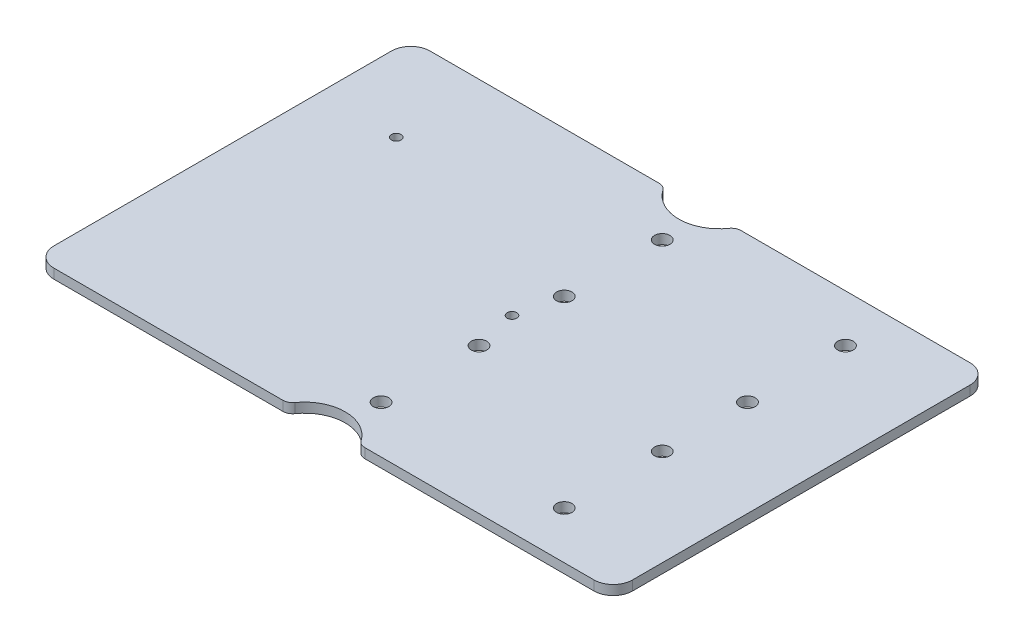
ISO-10303-21;
HEADER;
FILE_DESCRIPTION(('STEP AP214'),'2;1');
FILE_NAME('part.step','',(''),(''),'','','');
FILE_SCHEMA(('AUTOMOTIVE_DESIGN { 1 0 10303 214 1 1 1 1 }'));
ENDSEC;
DATA;
#1=APPLICATION_CONTEXT('core data for automotive mechanical design processes');
#2=APPLICATION_PROTOCOL_DEFINITION('international standard','automotive_design',2000,#1);
#3=PRODUCT_CONTEXT('',#1,'mechanical');
#4=PRODUCT('Part','Part','',(#3));
#5=PRODUCT_RELATED_PRODUCT_CATEGORY('part','',(#4));
#6=PRODUCT_DEFINITION_FORMATION('','',#4);
#7=PRODUCT_DEFINITION_CONTEXT('part definition',#1,'design');
#8=PRODUCT_DEFINITION('design','',#6,#7);
#9=PRODUCT_DEFINITION_SHAPE('','',#8);
#10=(LENGTH_UNIT() NAMED_UNIT(*) SI_UNIT(.MILLI.,.METRE.));
#11=(NAMED_UNIT(*) PLANE_ANGLE_UNIT() SI_UNIT($,.RADIAN.));
#12=(NAMED_UNIT(*) SI_UNIT($,.STERADIAN.) SOLID_ANGLE_UNIT());
#13=UNCERTAINTY_MEASURE_WITH_UNIT(LENGTH_MEASURE(1.E-05),#10,'distance_accuracy_value','');
#14=(GEOMETRIC_REPRESENTATION_CONTEXT(3) GLOBAL_UNCERTAINTY_ASSIGNED_CONTEXT((#13)) GLOBAL_UNIT_ASSIGNED_CONTEXT((#10,
#11,#12)) REPRESENTATION_CONTEXT('',''));
#15=CARTESIAN_POINT('',(0.,0.,0.));
#16=DIRECTION('',(0.,0.,1.));
#17=DIRECTION('',(1.,0.,0.));
#18=AXIS2_PLACEMENT_3D('',#15,#16,#17);
#19=CARTESIAN_POINT('',(20.,1.,19.5));
#20=DIRECTION('',(0.,0.,-1.));
#21=DIRECTION('',(-1.,0.,0.));
#22=AXIS2_PLACEMENT_3D('',#19,#20,#21);
#23=PLANE('',#22);
#24=DIRECTION('',(1.,0.,0.));
#25=VECTOR('',#24,1.);
#26=CARTESIAN_POINT('',(20.,1.,19.5));
#27=LINE('',#26,#25);
#28=CARTESIAN_POINT('',(-5.75264788368094,1.,19.5));
#29=VERTEX_POINT('',#28);
#30=CARTESIAN_POINT('',(18.,1.,19.5));
#31=VERTEX_POINT('',#30);
#32=EDGE_CURVE('E171',#29,#31,#27,.T.);
#33=ORIENTED_EDGE('',*,*,#32,.F.);
#34=DIRECTION('',(0.,1.,0.));
#35=VECTOR('',#34,1.);
#36=CARTESIAN_POINT('',(-5.75264788368094,0.,19.5));
#37=LINE('',#36,#35);
#38=CARTESIAN_POINT('',(-5.75264788368094,0.,19.5));
#39=VERTEX_POINT('',#38);
#40=EDGE_CURVE('E42',#29,#39,#37,.F.);
#41=ORIENTED_EDGE('',*,*,#40,.T.);
#42=DIRECTION('',(1.,0.,0.));
#43=VECTOR('',#42,1.);
#44=CARTESIAN_POINT('',(20.,0.,19.5));
#45=LINE('',#44,#43);
#46=CARTESIAN_POINT('',(18.,0.,19.5));
#47=VERTEX_POINT('',#46);
#48=EDGE_CURVE('E318',#39,#47,#45,.T.);
#49=ORIENTED_EDGE('',*,*,#48,.T.);
#50=DIRECTION('',(0.,-1.,0.));
#51=VECTOR('',#50,1.);
#52=CARTESIAN_POINT('',(18.,1.,19.5));
#53=LINE('',#52,#51);
#54=EDGE_CURVE('E202',#47,#31,#53,.F.);
#55=ORIENTED_EDGE('',*,*,#54,.T.);
#56=EDGE_LOOP('',(#33,#41,#49,#55));
#57=FACE_BOUND('',#56,.T.);
#58=ADVANCED_FACE('F34',(#57),#23,.F.);
#59=CARTESIAN_POINT('',(-38.,0.,19.5));
#60=VERTEX_POINT('',#59);
#61=CARTESIAN_POINT('',(-14.2473521163191,0.,19.5));
#62=VERTEX_POINT('',#61);
#63=EDGE_CURVE('E324',#60,#62,#45,.T.);
#64=ORIENTED_EDGE('',*,*,#63,.T.);
#65=DIRECTION('',(0.,1.,0.));
#66=VECTOR('',#65,1.);
#67=CARTESIAN_POINT('',(-14.2473521163191,1.,19.5));
#68=LINE('',#67,#66);
#69=CARTESIAN_POINT('',(-14.2473521163191,1.,19.5));
#70=VERTEX_POINT('',#69);
#71=EDGE_CURVE('E11',#62,#70,#68,.T.);
#72=ORIENTED_EDGE('',*,*,#71,.T.);
#73=CARTESIAN_POINT('',(-38.,1.,19.5));
#74=VERTEX_POINT('',#73);
#75=EDGE_CURVE('E174',#74,#70,#27,.T.);
#76=ORIENTED_EDGE('',*,*,#75,.F.);
#77=DIRECTION('',(0.,-1.,0.));
#78=VECTOR('',#77,1.);
#79=CARTESIAN_POINT('',(-38.,1.,19.5));
#80=LINE('',#79,#78);
#81=EDGE_CURVE('E199',#74,#60,#80,.T.);
#82=ORIENTED_EDGE('',*,*,#81,.T.);
#83=EDGE_LOOP('',(#64,#72,#76,#82));
#84=FACE_BOUND('',#83,.T.);
#85=ADVANCED_FACE('F351',(#84),#23,.F.);
#86=CARTESIAN_POINT('',(20.,1.,-19.5));
#87=DIRECTION('',(0.,0.,1.));
#88=DIRECTION('',(1.,0.,0.));
#89=AXIS2_PLACEMENT_3D('',#86,#87,#88);
#90=PLANE('',#89);
#91=DIRECTION('',(-1.,0.,0.));
#92=VECTOR('',#91,1.);
#93=CARTESIAN_POINT('',(20.,1.,-19.5));
#94=LINE('',#93,#92);
#95=CARTESIAN_POINT('',(-14.2473521163191,1.,-19.5));
#96=VERTEX_POINT('',#95);
#97=CARTESIAN_POINT('',(-38.,1.,-19.5));
#98=VERTEX_POINT('',#97);
#99=EDGE_CURVE('E323',#96,#98,#94,.T.);
#100=ORIENTED_EDGE('',*,*,#99,.F.);
#101=DIRECTION('',(0.,1.,0.));
#102=VECTOR('',#101,1.);
#103=CARTESIAN_POINT('',(-14.2473521163191,0.,-19.5));
#104=LINE('',#103,#102);
#105=CARTESIAN_POINT('',(-14.2473521163191,0.,-19.5));
#106=VERTEX_POINT('',#105);
#107=EDGE_CURVE('E249',#96,#106,#104,.F.);
#108=ORIENTED_EDGE('',*,*,#107,.T.);
#109=DIRECTION('',(-1.,0.,0.));
#110=VECTOR('',#109,1.);
#111=CARTESIAN_POINT('',(20.,0.,-19.5));
#112=LINE('',#111,#110);
#113=CARTESIAN_POINT('',(-38.,0.,-19.5));
#114=VERTEX_POINT('',#113);
#115=EDGE_CURVE('E172',#106,#114,#112,.T.);
#116=ORIENTED_EDGE('',*,*,#115,.T.);
#117=DIRECTION('',(0.,-1.,0.));
#118=VECTOR('',#117,1.);
#119=CARTESIAN_POINT('',(-38.,1.,-19.5));
#120=LINE('',#119,#118);
#121=EDGE_CURVE('E166',#114,#98,#120,.F.);
#122=ORIENTED_EDGE('',*,*,#121,.T.);
#123=EDGE_LOOP('',(#100,#108,#116,#122));
#124=FACE_BOUND('',#123,.T.);
#125=ADVANCED_FACE('F347',(#124),#90,.F.);
#126=CARTESIAN_POINT('',(18.,0.,-19.5));
#127=VERTEX_POINT('',#126);
#128=CARTESIAN_POINT('',(-5.75264788368094,0.,-19.5));
#129=VERTEX_POINT('',#128);
#130=EDGE_CURVE('E161',#127,#129,#112,.T.);
#131=ORIENTED_EDGE('',*,*,#130,.T.);
#132=DIRECTION('',(0.,1.,0.));
#133=VECTOR('',#132,1.);
#134=CARTESIAN_POINT('',(-5.75264788368094,1.,-19.5));
#135=LINE('',#134,#133);
#136=CARTESIAN_POINT('',(-5.75264788368094,1.,-19.5));
#137=VERTEX_POINT('',#136);
#138=EDGE_CURVE('E258',#129,#137,#135,.T.);
#139=ORIENTED_EDGE('',*,*,#138,.T.);
#140=CARTESIAN_POINT('',(18.,1.,-19.5));
#141=VERTEX_POINT('',#140);
#142=EDGE_CURVE('E164',#141,#137,#94,.T.);
#143=ORIENTED_EDGE('',*,*,#142,.F.);
#144=DIRECTION('',(0.,-1.,0.));
#145=VECTOR('',#144,1.);
#146=CARTESIAN_POINT('',(18.,1.,-19.5));
#147=LINE('',#146,#145);
#148=EDGE_CURVE('E151',#141,#127,#147,.T.);
#149=ORIENTED_EDGE('',*,*,#148,.T.);
#150=EDGE_LOOP('',(#131,#139,#143,#149));
#151=FACE_BOUND('',#150,.T.);
#152=ADVANCED_FACE('F160',(#151),#90,.F.);
#153=CARTESIAN_POINT('',(20.,1.,19.5));
#154=DIRECTION('',(-1.,0.,0.));
#155=DIRECTION('',(0.,0.,1.));
#156=AXIS2_PLACEMENT_3D('',#153,#154,#155);
#157=PLANE('',#156);
#158=DIRECTION('',(0.,0.,-1.));
#159=VECTOR('',#158,1.);
#160=CARTESIAN_POINT('',(20.,0.,19.5));
#161=LINE('',#160,#159);
#162=CARTESIAN_POINT('',(20.,0.,17.5));
#163=VERTEX_POINT('',#162);
#164=CARTESIAN_POINT('',(20.,0.,-17.5));
#165=VERTEX_POINT('',#164);
#166=EDGE_CURVE('E176',#163,#165,#161,.T.);
#167=ORIENTED_EDGE('',*,*,#166,.T.);
#168=DIRECTION('',(0.,-1.,0.));
#169=VECTOR('',#168,1.);
#170=CARTESIAN_POINT('',(20.,1.,-17.5));
#171=LINE('',#170,#169);
#172=CARTESIAN_POINT('',(20.,1.,-17.5));
#173=VERTEX_POINT('',#172);
#174=EDGE_CURVE('E152',#165,#173,#171,.F.);
#175=ORIENTED_EDGE('',*,*,#174,.T.);
#176=DIRECTION('',(0.,0.,-1.));
#177=VECTOR('',#176,1.);
#178=CARTESIAN_POINT('',(20.,1.,19.5));
#179=LINE('',#178,#177);
#180=CARTESIAN_POINT('',(20.,1.,17.5));
#181=VERTEX_POINT('',#180);
#182=EDGE_CURVE('E320',#181,#173,#179,.T.);
#183=ORIENTED_EDGE('',*,*,#182,.F.);
#184=DIRECTION('',(0.,-1.,0.));
#185=VECTOR('',#184,1.);
#186=CARTESIAN_POINT('',(20.,1.,17.5));
#187=LINE('',#186,#185);
#188=EDGE_CURVE('E155',#181,#163,#187,.T.);
#189=ORIENTED_EDGE('',*,*,#188,.T.);
#190=EDGE_LOOP('',(#167,#175,#183,#189));
#191=FACE_BOUND('',#190,.T.);
#192=ADVANCED_FACE('F336',(#191),#157,.F.);
#193=CARTESIAN_POINT('',(0.,1.,0.));
#194=DIRECTION('',(0.,1.,0.));
#195=DIRECTION('',(0.,0.,1.));
#196=AXIS2_PLACEMENT_3D('',#193,#194,#195);
#197=PLANE('',#196);
#198=CARTESIAN_POINT('',(-10.,0.999999999999999,0.));
#199=DIRECTION('',(0.,1.,0.));
#200=DIRECTION('',(0.,0.,1.));
#201=AXIS2_PLACEMENT_3D('',#198,#199,#200);
#202=CIRCLE('',#201,0.500000000000001);
#203=CARTESIAN_POINT('',(-10.,0.999999999999999,0.500000000000001));
#204=VERTEX_POINT('',#203);
#205=EDGE_CURVE('E390',#204,#204,#202,.F.);
#206=ORIENTED_EDGE('',*,*,#205,.T.);
#207=EDGE_LOOP('',(#206));
#208=FACE_BOUND('',#207,.T.);
#209=CARTESIAN_POINT('',(-32.,0.999999999999999,-10.));
#210=DIRECTION('',(0.,1.,0.));
#211=DIRECTION('',(0.,0.,1.));
#212=AXIS2_PLACEMENT_3D('',#209,#210,#211);
#213=CIRCLE('',#212,0.499999999999999);
#214=CARTESIAN_POINT('',(-32.,0.999999999999999,-9.5));
#215=VERTEX_POINT('',#214);
#216=EDGE_CURVE('E383',#215,#215,#213,.F.);
#217=ORIENTED_EDGE('',*,*,#216,.T.);
#218=EDGE_LOOP('',(#217));
#219=FACE_BOUND('',#218,.T.);
#220=CARTESIAN_POINT('',(9.99999999999993,1.,-14.5800000000001));
#221=DIRECTION('',(0.,1.,0.));
#222=DIRECTION('',(0.,0.,1.));
#223=AXIS2_PLACEMENT_3D('',#220,#221,#222);
#224=CIRCLE('',#223,0.799999999999997);
#225=CARTESIAN_POINT('',(9.99999999999993,1.,-13.7800000000001));
#226=VERTEX_POINT('',#225);
#227=EDGE_CURVE('E232',#226,#226,#224,.T.);
#228=ORIENTED_EDGE('',*,*,#227,.F.);
#229=EDGE_LOOP('',(#228));
#230=FACE_BOUND('',#229,.T.);
#231=CARTESIAN_POINT('',(10.,1.,-4.42000000000007));
#232=DIRECTION('',(0.,1.,0.));
#233=DIRECTION('',(0.,0.,1.));
#234=AXIS2_PLACEMENT_3D('',#231,#232,#233);
#235=CIRCLE('',#234,0.799999999999997);
#236=CARTESIAN_POINT('',(10.,1.,-3.62000000000007));
#237=VERTEX_POINT('',#236);
#238=EDGE_CURVE('E231',#237,#237,#235,.T.);
#239=ORIENTED_EDGE('',*,*,#238,.F.);
#240=EDGE_LOOP('',(#239));
#241=FACE_BOUND('',#240,.T.);
#242=CARTESIAN_POINT('',(9.99999999999993,1.,4.41999999999993));
#243=DIRECTION('',(0.,1.,0.));
#244=DIRECTION('',(0.,0.,1.));
#245=AXIS2_PLACEMENT_3D('',#242,#243,#244);
#246=CIRCLE('',#245,0.799999999999997);
#247=CARTESIAN_POINT('',(9.99999999999993,1.,5.21999999999993));
#248=VERTEX_POINT('',#247);
#249=EDGE_CURVE('E294',#248,#248,#246,.T.);
#250=ORIENTED_EDGE('',*,*,#249,.F.);
#251=EDGE_LOOP('',(#250));
#252=FACE_BOUND('',#251,.T.);
#253=CARTESIAN_POINT('',(10.,1.,14.5799999999999));
#254=DIRECTION('',(0.,1.,0.));
#255=DIRECTION('',(0.,0.,1.));
#256=AXIS2_PLACEMENT_3D('',#253,#254,#255);
#257=CIRCLE('',#256,0.799999999999997);
#258=CARTESIAN_POINT('',(10.,1.,15.3799999999999));
#259=VERTEX_POINT('',#258);
#260=EDGE_CURVE('E300',#259,#259,#257,.T.);
#261=ORIENTED_EDGE('',*,*,#260,.F.);
#262=EDGE_LOOP('',(#261));
#263=FACE_BOUND('',#262,.T.);
#264=CARTESIAN_POINT('',(-9.,1.,14.5800000000001));
#265=DIRECTION('',(0.,1.,0.));
#266=DIRECTION('',(0.,0.,1.));
#267=AXIS2_PLACEMENT_3D('',#264,#265,#266);
#268=CIRCLE('',#267,0.799999999999997);
#269=CARTESIAN_POINT('',(-9.,1.,15.3800000000001));
#270=VERTEX_POINT('',#269);
#271=EDGE_CURVE('E227',#270,#270,#268,.T.);
#272=ORIENTED_EDGE('',*,*,#271,.F.);
#273=EDGE_LOOP('',(#272));
#274=FACE_BOUND('',#273,.T.);
#275=CARTESIAN_POINT('',(-9.00000000000007,1.,4.42000000000006));
#276=DIRECTION('',(0.,1.,0.));
#277=DIRECTION('',(0.,0.,1.));
#278=AXIS2_PLACEMENT_3D('',#275,#276,#277);
#279=CIRCLE('',#278,0.799999999999997);
#280=CARTESIAN_POINT('',(-9.00000000000007,1.,5.22000000000006));
#281=VERTEX_POINT('',#280);
#282=EDGE_CURVE('E223',#281,#281,#279,.T.);
#283=ORIENTED_EDGE('',*,*,#282,.F.);
#284=EDGE_LOOP('',(#283));
#285=FACE_BOUND('',#284,.T.);
#286=CARTESIAN_POINT('',(-9.,1.,-4.41999999999994));
#287=DIRECTION('',(0.,1.,0.));
#288=DIRECTION('',(0.,0.,1.));
#289=AXIS2_PLACEMENT_3D('',#286,#287,#288);
#290=CIRCLE('',#289,0.799999999999997);
#291=CARTESIAN_POINT('',(-9.,1.,-3.61999999999994));
#292=VERTEX_POINT('',#291);
#293=EDGE_CURVE('E219',#292,#292,#290,.T.);
#294=ORIENTED_EDGE('',*,*,#293,.F.);
#295=EDGE_LOOP('',(#294));
#296=FACE_BOUND('',#295,.T.);
#297=CARTESIAN_POINT('',(-9.00000000000007,1.,-14.5799999999999));
#298=DIRECTION('',(0.,1.,0.));
#299=DIRECTION('',(0.,0.,1.));
#300=AXIS2_PLACEMENT_3D('',#297,#298,#299);
#301=CIRCLE('',#300,0.799999999999997);
#302=CARTESIAN_POINT('',(-9.00000000000007,1.,-13.7799999999999));
#303=VERTEX_POINT('',#302);
#304=EDGE_CURVE('E215',#303,#303,#301,.T.);
#305=ORIENTED_EDGE('',*,*,#304,.F.);
#306=EDGE_LOOP('',(#305));
#307=FACE_BOUND('',#306,.T.);
#308=CARTESIAN_POINT('',(-10.,1.,-21.5));
#309=DIRECTION('',(0.,1.,0.));
#310=DIRECTION('',(0.,0.,1.));
#311=AXIS2_PLACEMENT_3D('',#308,#309,#310);
#312=CIRCLE('',#311,4.2);
#313=CARTESIAN_POINT('',(-6.56944636758845,1.,-19.0769230769231));
#314=VERTEX_POINT('',#313);
#315=CARTESIAN_POINT('',(-13.4305536324116,1.,-19.0769230769231));
#316=VERTEX_POINT('',#315);
#317=EDGE_CURVE('E282',#314,#316,#312,.F.);
#318=ORIENTED_EDGE('',*,*,#317,.T.);
#319=CARTESIAN_POINT('',(-14.2473521163191,1.,-18.5));
#320=DIRECTION('',(0.,1.,0.));
#321=DIRECTION('',(0.,0.,1.));
#322=AXIS2_PLACEMENT_3D('',#319,#320,#321);
#323=CIRCLE('',#322,1.);
#324=EDGE_CURVE('E247',#316,#96,#323,.T.);
#325=ORIENTED_EDGE('',*,*,#324,.T.);
#326=ORIENTED_EDGE('',*,*,#99,.T.);
#327=CARTESIAN_POINT('',(-38.,1.,-17.5));
#328=DIRECTION('',(0.,1.,0.));
#329=DIRECTION('',(0.,0.,1.));
#330=AXIS2_PLACEMENT_3D('',#327,#328,#329);
#331=CIRCLE('',#330,2.);
#332=CARTESIAN_POINT('',(-40.,1.,-17.5));
#333=VERTEX_POINT('',#332);
#334=EDGE_CURVE('E193',#98,#333,#331,.T.);
#335=ORIENTED_EDGE('',*,*,#334,.T.);
#336=DIRECTION('',(0.,0.,1.));
#337=VECTOR('',#336,1.);
#338=CARTESIAN_POINT('',(-40.,1.,-19.5));
#339=LINE('',#338,#337);
#340=CARTESIAN_POINT('',(-40.,1.,17.5));
#341=VERTEX_POINT('',#340);
#342=EDGE_CURVE('E316',#333,#341,#339,.T.);
#343=ORIENTED_EDGE('',*,*,#342,.T.);
#344=CARTESIAN_POINT('',(-38.,1.,17.5));
#345=DIRECTION('',(0.,1.,0.));
#346=DIRECTION('',(0.,0.,1.));
#347=AXIS2_PLACEMENT_3D('',#344,#345,#346);
#348=CIRCLE('',#347,2.);
#349=EDGE_CURVE('E191',#341,#74,#348,.T.);
#350=ORIENTED_EDGE('',*,*,#349,.T.);
#351=ORIENTED_EDGE('',*,*,#75,.T.);
#352=CARTESIAN_POINT('',(-14.2473521163191,1.,18.5));
#353=DIRECTION('',(0.,1.,0.));
#354=DIRECTION('',(0.,0.,1.));
#355=AXIS2_PLACEMENT_3D('',#352,#353,#354);
#356=CIRCLE('',#355,1.);
#357=CARTESIAN_POINT('',(-13.4305536324116,1.,19.0769230769231));
#358=VERTEX_POINT('',#357);
#359=EDGE_CURVE('E241',#70,#358,#356,.T.);
#360=ORIENTED_EDGE('',*,*,#359,.T.);
#361=CARTESIAN_POINT('',(-10.,1.,21.5));
#362=DIRECTION('',(0.,1.,0.));
#363=DIRECTION('',(0.,0.,1.));
#364=AXIS2_PLACEMENT_3D('',#361,#362,#363);
#365=CIRCLE('',#364,4.2);
#366=CARTESIAN_POINT('',(-6.56944636758845,1.,19.0769230769231));
#367=VERTEX_POINT('',#366);
#368=EDGE_CURVE('E271',#358,#367,#365,.F.);
#369=ORIENTED_EDGE('',*,*,#368,.T.);
#370=CARTESIAN_POINT('',(-5.75264788368094,1.,18.5));
#371=DIRECTION('',(0.,1.,0.));
#372=DIRECTION('',(0.,0.,1.));
#373=AXIS2_PLACEMENT_3D('',#370,#371,#372);
#374=CIRCLE('',#373,1.);
#375=EDGE_CURVE('E243',#367,#29,#374,.T.);
#376=ORIENTED_EDGE('',*,*,#375,.T.);
#377=ORIENTED_EDGE('',*,*,#32,.T.);
#378=CARTESIAN_POINT('',(18.,1.,17.5));
#379=DIRECTION('',(0.,1.,0.));
#380=DIRECTION('',(0.,0.,1.));
#381=AXIS2_PLACEMENT_3D('',#378,#379,#380);
#382=CIRCLE('',#381,2.);
#383=EDGE_CURVE('E195',#31,#181,#382,.T.);
#384=ORIENTED_EDGE('',*,*,#383,.T.);
#385=ORIENTED_EDGE('',*,*,#182,.T.);
#386=CARTESIAN_POINT('',(18.,1.,-17.5));
#387=DIRECTION('',(0.,1.,0.));
#388=DIRECTION('',(0.,0.,1.));
#389=AXIS2_PLACEMENT_3D('',#386,#387,#388);
#390=CIRCLE('',#389,2.);
#391=EDGE_CURVE('E197',#173,#141,#390,.T.);
#392=ORIENTED_EDGE('',*,*,#391,.T.);
#393=ORIENTED_EDGE('',*,*,#142,.T.);
#394=CARTESIAN_POINT('',(-5.75264788368094,1.,-18.5));
#395=DIRECTION('',(0.,1.,0.));
#396=DIRECTION('',(0.,0.,1.));
#397=AXIS2_PLACEMENT_3D('',#394,#395,#396);
#398=CIRCLE('',#397,1.);
#399=EDGE_CURVE('E245',#137,#314,#398,.T.);
#400=ORIENTED_EDGE('',*,*,#399,.T.);
#401=EDGE_LOOP('',(#318,#325,#326,#335,#343,#350,#351,#360,#369,#376,#377,#384,#385,#392,#393,#400));
#402=FACE_BOUND('',#401,.T.);
#403=ADVANCED_FACE('F279',(#208,#219,#230,#241,#252,#263,#274,#285,#296,#307,#402),#197,.T.);
#404=CARTESIAN_POINT('',(0.,0.,0.));
#405=DIRECTION('',(0.,1.,0.));
#406=DIRECTION('',(0.,0.,1.));
#407=AXIS2_PLACEMENT_3D('',#404,#405,#406);
#408=PLANE('',#407);
#409=CARTESIAN_POINT('',(-10.,0.,0.));
#410=DIRECTION('',(0.,1.,0.));
#411=DIRECTION('',(0.,0.,1.));
#412=AXIS2_PLACEMENT_3D('',#409,#410,#411);
#413=CIRCLE('',#412,0.500000000000001);
#414=CARTESIAN_POINT('',(-10.,0.,0.500000000000001));
#415=VERTEX_POINT('',#414);
#416=EDGE_CURVE('E393',#415,#415,#413,.T.);
#417=ORIENTED_EDGE('',*,*,#416,.T.);
#418=EDGE_LOOP('',(#417));
#419=FACE_BOUND('',#418,.T.);
#420=CARTESIAN_POINT('',(-32.,0.,-10.));
#421=DIRECTION('',(0.,1.,0.));
#422=DIRECTION('',(0.,0.,1.));
#423=AXIS2_PLACEMENT_3D('',#420,#421,#422);
#424=CIRCLE('',#423,0.499999999999999);
#425=CARTESIAN_POINT('',(-32.,0.,-9.5));
#426=VERTEX_POINT('',#425);
#427=EDGE_CURVE('E385',#426,#426,#424,.T.);
#428=ORIENTED_EDGE('',*,*,#427,.T.);
#429=EDGE_LOOP('',(#428));
#430=FACE_BOUND('',#429,.T.);
#431=ORIENTED_EDGE('',*,*,#115,.F.);
#432=CARTESIAN_POINT('',(-14.2473521163191,0.,-18.5));
#433=DIRECTION('',(0.,1.,0.));
#434=DIRECTION('',(0.,0.,1.));
#435=AXIS2_PLACEMENT_3D('',#432,#433,#434);
#436=CIRCLE('',#435,1.);
#437=CARTESIAN_POINT('',(-13.4305536324116,0.,-19.0769230769231));
#438=VERTEX_POINT('',#437);
#439=EDGE_CURVE('E256',#106,#438,#436,.F.);
#440=ORIENTED_EDGE('',*,*,#439,.T.);
#441=CARTESIAN_POINT('',(-10.,0.,-21.5));
#442=DIRECTION('',(0.,1.,0.));
#443=DIRECTION('',(0.,0.,1.));
#444=AXIS2_PLACEMENT_3D('',#441,#442,#443);
#445=CIRCLE('',#444,4.2);
#446=CARTESIAN_POINT('',(-6.56944636758845,0.,-19.0769230769231));
#447=VERTEX_POINT('',#446);
#448=EDGE_CURVE('E210',#447,#438,#445,.F.);
#449=ORIENTED_EDGE('',*,*,#448,.F.);
#450=CARTESIAN_POINT('',(-5.75264788368094,0.,-18.5));
#451=DIRECTION('',(0.,1.,0.));
#452=DIRECTION('',(0.,0.,1.));
#453=AXIS2_PLACEMENT_3D('',#450,#451,#452);
#454=CIRCLE('',#453,1.);
#455=EDGE_CURVE('E56',#447,#129,#454,.F.);
#456=ORIENTED_EDGE('',*,*,#455,.T.);
#457=ORIENTED_EDGE('',*,*,#130,.F.);
#458=CARTESIAN_POINT('',(18.,0.,-17.5));
#459=DIRECTION('',(0.,1.,0.));
#460=DIRECTION('',(0.,0.,1.));
#461=AXIS2_PLACEMENT_3D('',#458,#459,#460);
#462=CIRCLE('',#461,2.);
#463=EDGE_CURVE('E147',#127,#165,#462,.F.);
#464=ORIENTED_EDGE('',*,*,#463,.T.);
#465=ORIENTED_EDGE('',*,*,#166,.F.);
#466=CARTESIAN_POINT('',(18.,0.,17.5));
#467=DIRECTION('',(0.,1.,0.));
#468=DIRECTION('',(0.,0.,1.));
#469=AXIS2_PLACEMENT_3D('',#466,#467,#468);
#470=CIRCLE('',#469,2.);
#471=EDGE_CURVE('E156',#163,#47,#470,.F.);
#472=ORIENTED_EDGE('',*,*,#471,.T.);
#473=ORIENTED_EDGE('',*,*,#48,.F.);
#474=CARTESIAN_POINT('',(-5.75264788368094,0.,18.5));
#475=DIRECTION('',(0.,1.,0.));
#476=DIRECTION('',(0.,0.,1.));
#477=AXIS2_PLACEMENT_3D('',#474,#475,#476);
#478=CIRCLE('',#477,1.);
#479=CARTESIAN_POINT('',(-6.56944636758845,0.,19.0769230769231));
#480=VERTEX_POINT('',#479);
#481=EDGE_CURVE('E253',#39,#480,#478,.F.);
#482=ORIENTED_EDGE('',*,*,#481,.T.);
#483=CARTESIAN_POINT('',(-10.,0.,21.5));
#484=DIRECTION('',(0.,1.,0.));
#485=DIRECTION('',(0.,0.,1.));
#486=AXIS2_PLACEMENT_3D('',#483,#484,#485);
#487=CIRCLE('',#486,4.2);
#488=CARTESIAN_POINT('',(-13.4305536324116,0.,19.0769230769231));
#489=VERTEX_POINT('',#488);
#490=EDGE_CURVE('E274',#480,#489,#487,.T.);
#491=ORIENTED_EDGE('',*,*,#490,.T.);
#492=CARTESIAN_POINT('',(-14.2473521163191,0.,18.5));
#493=DIRECTION('',(0.,1.,0.));
#494=DIRECTION('',(0.,0.,1.));
#495=AXIS2_PLACEMENT_3D('',#492,#493,#494);
#496=CIRCLE('',#495,1.);
#497=EDGE_CURVE('E251',#489,#62,#496,.F.);
#498=ORIENTED_EDGE('',*,*,#497,.T.);
#499=ORIENTED_EDGE('',*,*,#63,.F.);
#500=CARTESIAN_POINT('',(-38.,0.,17.5));
#501=DIRECTION('',(0.,1.,0.));
#502=DIRECTION('',(0.,0.,1.));
#503=AXIS2_PLACEMENT_3D('',#500,#501,#502);
#504=CIRCLE('',#503,2.);
#505=CARTESIAN_POINT('',(-40.,0.,17.5));
#506=VERTEX_POINT('',#505);
#507=EDGE_CURVE('E165',#60,#506,#504,.F.);
#508=ORIENTED_EDGE('',*,*,#507,.T.);
#509=DIRECTION('',(0.,0.,1.));
#510=VECTOR('',#509,1.);
#511=CARTESIAN_POINT('',(-40.,0.,-19.5));
#512=LINE('',#511,#510);
#513=CARTESIAN_POINT('',(-40.,0.,-17.5));
#514=VERTEX_POINT('',#513);
#515=EDGE_CURVE('E214',#514,#506,#512,.T.);
#516=ORIENTED_EDGE('',*,*,#515,.F.);
#517=CARTESIAN_POINT('',(-38.,0.,-17.5));
#518=DIRECTION('',(0.,1.,0.));
#519=DIRECTION('',(0.,0.,1.));
#520=AXIS2_PLACEMENT_3D('',#517,#518,#519);
#521=CIRCLE('',#520,2.);
#522=EDGE_CURVE('E183',#514,#114,#521,.F.);
#523=ORIENTED_EDGE('',*,*,#522,.T.);
#524=EDGE_LOOP('',(#431,#440,#449,#456,#457,#464,#465,#472,#473,#482,#491,#498,#499,#508,#516,#523));
#525=FACE_BOUND('',#524,.T.);
#526=CARTESIAN_POINT('',(9.99999999999993,0.,-14.5800000000001));
#527=DIRECTION('',(0.,1.,0.));
#528=DIRECTION('',(0.,0.,1.));
#529=AXIS2_PLACEMENT_3D('',#526,#527,#528);
#530=CIRCLE('',#529,0.799999999999996);
#531=CARTESIAN_POINT('',(9.99999999999993,0.,-13.7800000000001));
#532=VERTEX_POINT('',#531);
#533=EDGE_CURVE('E228',#532,#532,#530,.T.);
#534=ORIENTED_EDGE('',*,*,#533,.T.);
#535=EDGE_LOOP('',(#534));
#536=FACE_BOUND('',#535,.T.);
#537=CARTESIAN_POINT('',(10.,0.,-4.42000000000007));
#538=DIRECTION('',(0.,1.,0.));
#539=DIRECTION('',(0.,0.,1.));
#540=AXIS2_PLACEMENT_3D('',#537,#538,#539);
#541=CIRCLE('',#540,0.799999999999996);
#542=CARTESIAN_POINT('',(10.,0.,-3.62000000000007));
#543=VERTEX_POINT('',#542);
#544=EDGE_CURVE('E291',#543,#543,#541,.T.);
#545=ORIENTED_EDGE('',*,*,#544,.T.);
#546=EDGE_LOOP('',(#545));
#547=FACE_BOUND('',#546,.T.);
#548=CARTESIAN_POINT('',(9.99999999999993,0.,4.41999999999993));
#549=DIRECTION('',(0.,1.,0.));
#550=DIRECTION('',(0.,0.,1.));
#551=AXIS2_PLACEMENT_3D('',#548,#549,#550);
#552=CIRCLE('',#551,0.799999999999996);
#553=CARTESIAN_POINT('',(9.99999999999993,0.,5.21999999999993));
#554=VERTEX_POINT('',#553);
#555=EDGE_CURVE('E297',#554,#554,#552,.T.);
#556=ORIENTED_EDGE('',*,*,#555,.T.);
#557=EDGE_LOOP('',(#556));
#558=FACE_BOUND('',#557,.T.);
#559=CARTESIAN_POINT('',(10.,0.,14.5799999999999));
#560=DIRECTION('',(0.,1.,0.));
#561=DIRECTION('',(0.,0.,1.));
#562=AXIS2_PLACEMENT_3D('',#559,#560,#561);
#563=CIRCLE('',#562,0.799999999999996);
#564=CARTESIAN_POINT('',(10.,0.,15.3799999999999));
#565=VERTEX_POINT('',#564);
#566=EDGE_CURVE('E303',#565,#565,#563,.T.);
#567=ORIENTED_EDGE('',*,*,#566,.T.);
#568=EDGE_LOOP('',(#567));
#569=FACE_BOUND('',#568,.T.);
#570=CARTESIAN_POINT('',(-9.,0.,14.5800000000001));
#571=DIRECTION('',(0.,1.,0.));
#572=DIRECTION('',(0.,0.,1.));
#573=AXIS2_PLACEMENT_3D('',#570,#571,#572);
#574=CIRCLE('',#573,0.799999999999996);
#575=CARTESIAN_POINT('',(-9.,0.,15.3800000000001));
#576=VERTEX_POINT('',#575);
#577=EDGE_CURVE('E224',#576,#576,#574,.T.);
#578=ORIENTED_EDGE('',*,*,#577,.T.);
#579=EDGE_LOOP('',(#578));
#580=FACE_BOUND('',#579,.T.);
#581=CARTESIAN_POINT('',(-9.00000000000007,0.,4.42000000000006));
#582=DIRECTION('',(0.,1.,0.));
#583=DIRECTION('',(0.,0.,1.));
#584=AXIS2_PLACEMENT_3D('',#581,#582,#583);
#585=CIRCLE('',#584,0.799999999999996);
#586=CARTESIAN_POINT('',(-9.00000000000007,0.,5.22000000000006));
#587=VERTEX_POINT('',#586);
#588=EDGE_CURVE('E220',#587,#587,#585,.T.);
#589=ORIENTED_EDGE('',*,*,#588,.T.);
#590=EDGE_LOOP('',(#589));
#591=FACE_BOUND('',#590,.T.);
#592=CARTESIAN_POINT('',(-9.,0.,-4.41999999999994));
#593=DIRECTION('',(0.,1.,0.));
#594=DIRECTION('',(0.,0.,1.));
#595=AXIS2_PLACEMENT_3D('',#592,#593,#594);
#596=CIRCLE('',#595,0.799999999999996);
#597=CARTESIAN_POINT('',(-9.,0.,-3.61999999999994));
#598=VERTEX_POINT('',#597);
#599=EDGE_CURVE('E216',#598,#598,#596,.T.);
#600=ORIENTED_EDGE('',*,*,#599,.T.);
#601=EDGE_LOOP('',(#600));
#602=FACE_BOUND('',#601,.T.);
#603=CARTESIAN_POINT('',(-9.00000000000007,0.,-14.5799999999999));
#604=DIRECTION('',(0.,1.,0.));
#605=DIRECTION('',(0.,0.,1.));
#606=AXIS2_PLACEMENT_3D('',#603,#604,#605);
#607=CIRCLE('',#606,0.799999999999996);
#608=CARTESIAN_POINT('',(-9.00000000000007,0.,-13.7799999999999));
#609=VERTEX_POINT('',#608);
#610=EDGE_CURVE('E211',#609,#609,#607,.T.);
#611=ORIENTED_EDGE('',*,*,#610,.T.);
#612=EDGE_LOOP('',(#611));
#613=FACE_BOUND('',#612,.T.);
#614=ADVANCED_FACE('F169',(#419,#430,#525,#536,#547,#558,#569,#580,#591,#602,#613),#408,.F.);
#615=CARTESIAN_POINT('',(-40.,44.8292140016223,-19.5));
#616=DIRECTION('',(1.,0.,0.));
#617=DIRECTION('',(0.,0.,-1.));
#618=AXIS2_PLACEMENT_3D('',#615,#616,#617);
#619=PLANE('',#618);
#620=ORIENTED_EDGE('',*,*,#342,.F.);
#621=DIRECTION('',(0.,-1.,0.));
#622=VECTOR('',#621,1.);
#623=CARTESIAN_POINT('',(-40.,44.8292140016223,-17.5));
#624=LINE('',#623,#622);
#625=EDGE_CURVE('E207',#333,#514,#624,.T.);
#626=ORIENTED_EDGE('',*,*,#625,.T.);
#627=ORIENTED_EDGE('',*,*,#515,.T.);
#628=DIRECTION('',(0.,-1.,0.));
#629=VECTOR('',#628,1.);
#630=CARTESIAN_POINT('',(-40.,44.8292140016223,17.5));
#631=LINE('',#630,#629);
#632=EDGE_CURVE('E205',#506,#341,#631,.F.);
#633=ORIENTED_EDGE('',*,*,#632,.T.);
#634=EDGE_LOOP('',(#620,#626,#627,#633));
#635=FACE_BOUND('',#634,.T.);
#636=ADVANCED_FACE('F357',(#635),#619,.F.);
#637=CARTESIAN_POINT('',(18.,1.,-17.5));
#638=DIRECTION('',(0.,-1.,0.));
#639=DIRECTION('',(0.,0.,-1.));
#640=AXIS2_PLACEMENT_3D('',#637,#638,#639);
#641=CYLINDRICAL_SURFACE('',#640,2.);
#642=ORIENTED_EDGE('',*,*,#391,.F.);
#643=ORIENTED_EDGE('',*,*,#174,.F.);
#644=ORIENTED_EDGE('',*,*,#463,.F.);
#645=ORIENTED_EDGE('',*,*,#148,.F.);
#646=EDGE_LOOP('',(#642,#643,#644,#645));
#647=FACE_BOUND('',#646,.T.);
#648=ADVANCED_FACE('F150',(#647),#641,.T.);
#649=CARTESIAN_POINT('',(18.,1.,17.5));
#650=DIRECTION('',(0.,-1.,0.));
#651=DIRECTION('',(0.,0.,-1.));
#652=AXIS2_PLACEMENT_3D('',#649,#650,#651);
#653=CYLINDRICAL_SURFACE('',#652,2.);
#654=ORIENTED_EDGE('',*,*,#383,.F.);
#655=ORIENTED_EDGE('',*,*,#54,.F.);
#656=ORIENTED_EDGE('',*,*,#471,.F.);
#657=ORIENTED_EDGE('',*,*,#188,.F.);
#658=EDGE_LOOP('',(#654,#655,#656,#657));
#659=FACE_BOUND('',#658,.T.);
#660=ADVANCED_FACE('F333',(#659),#653,.T.);
#661=CARTESIAN_POINT('',(-38.,44.8292140016223,-17.5));
#662=DIRECTION('',(0.,-1.,0.));
#663=DIRECTION('',(0.,0.,-1.));
#664=AXIS2_PLACEMENT_3D('',#661,#662,#663);
#665=CYLINDRICAL_SURFACE('',#664,2.);
#666=ORIENTED_EDGE('',*,*,#334,.F.);
#667=ORIENTED_EDGE('',*,*,#121,.F.);
#668=ORIENTED_EDGE('',*,*,#522,.F.);
#669=ORIENTED_EDGE('',*,*,#625,.F.);
#670=EDGE_LOOP('',(#666,#667,#668,#669));
#671=FACE_BOUND('',#670,.T.);
#672=ADVANCED_FACE('F359',(#671),#665,.T.);
#673=CARTESIAN_POINT('',(-38.,1.,17.5));
#674=DIRECTION('',(0.,-1.,0.));
#675=DIRECTION('',(0.,0.,-1.));
#676=AXIS2_PLACEMENT_3D('',#673,#674,#675);
#677=CYLINDRICAL_SURFACE('',#676,2.);
#678=ORIENTED_EDGE('',*,*,#349,.F.);
#679=ORIENTED_EDGE('',*,*,#632,.F.);
#680=ORIENTED_EDGE('',*,*,#507,.F.);
#681=ORIENTED_EDGE('',*,*,#81,.F.);
#682=EDGE_LOOP('',(#678,#679,#680,#681));
#683=FACE_BOUND('',#682,.T.);
#684=ADVANCED_FACE('F362',(#683),#677,.T.);
#685=CARTESIAN_POINT('',(-9.00000000000007,1.,-14.5799999999999));
#686=DIRECTION('',(0.,1.,0.));
#687=DIRECTION('',(0.,0.,1.));
#688=AXIS2_PLACEMENT_3D('',#685,#686,#687);
#689=CYLINDRICAL_SURFACE('',#688,0.799999999999996);
#690=ORIENTED_EDGE('',*,*,#304,.T.);
#691=EDGE_LOOP('',(#690));
#692=FACE_BOUND('',#691,.T.);
#693=ORIENTED_EDGE('',*,*,#610,.F.);
#694=EDGE_LOOP('',(#693));
#695=FACE_BOUND('',#694,.T.);
#696=ADVANCED_FACE('F366',(#692,#695),#689,.F.);
#697=CARTESIAN_POINT('',(-9.,1.,-4.41999999999994));
#698=DIRECTION('',(0.,1.,0.));
#699=DIRECTION('',(0.,0.,1.));
#700=AXIS2_PLACEMENT_3D('',#697,#698,#699);
#701=CYLINDRICAL_SURFACE('',#700,0.799999999999996);
#702=ORIENTED_EDGE('',*,*,#293,.T.);
#703=EDGE_LOOP('',(#702));
#704=FACE_BOUND('',#703,.T.);
#705=ORIENTED_EDGE('',*,*,#599,.F.);
#706=EDGE_LOOP('',(#705));
#707=FACE_BOUND('',#706,.T.);
#708=ADVANCED_FACE('F438',(#704,#707),#701,.F.);
#709=CARTESIAN_POINT('',(-9.00000000000007,1.,4.42000000000006));
#710=DIRECTION('',(0.,1.,0.));
#711=DIRECTION('',(0.,0.,1.));
#712=AXIS2_PLACEMENT_3D('',#709,#710,#711);
#713=CYLINDRICAL_SURFACE('',#712,0.799999999999996);
#714=ORIENTED_EDGE('',*,*,#282,.T.);
#715=EDGE_LOOP('',(#714));
#716=FACE_BOUND('',#715,.T.);
#717=ORIENTED_EDGE('',*,*,#588,.F.);
#718=EDGE_LOOP('',(#717));
#719=FACE_BOUND('',#718,.T.);
#720=ADVANCED_FACE('F434',(#716,#719),#713,.F.);
#721=CARTESIAN_POINT('',(-9.,1.,14.5800000000001));
#722=DIRECTION('',(0.,1.,0.));
#723=DIRECTION('',(0.,0.,1.));
#724=AXIS2_PLACEMENT_3D('',#721,#722,#723);
#725=CYLINDRICAL_SURFACE('',#724,0.799999999999996);
#726=ORIENTED_EDGE('',*,*,#271,.T.);
#727=EDGE_LOOP('',(#726));
#728=FACE_BOUND('',#727,.T.);
#729=ORIENTED_EDGE('',*,*,#577,.F.);
#730=EDGE_LOOP('',(#729));
#731=FACE_BOUND('',#730,.T.);
#732=ADVANCED_FACE('F430',(#728,#731),#725,.F.);
#733=CARTESIAN_POINT('',(10.,1.,14.5799999999999));
#734=DIRECTION('',(0.,1.,0.));
#735=DIRECTION('',(0.,0.,1.));
#736=AXIS2_PLACEMENT_3D('',#733,#734,#735);
#737=CYLINDRICAL_SURFACE('',#736,0.799999999999996);
#738=ORIENTED_EDGE('',*,*,#260,.T.);
#739=EDGE_LOOP('',(#738));
#740=FACE_BOUND('',#739,.T.);
#741=ORIENTED_EDGE('',*,*,#566,.F.);
#742=EDGE_LOOP('',(#741));
#743=FACE_BOUND('',#742,.T.);
#744=ADVANCED_FACE('F426',(#740,#743),#737,.F.);
#745=CARTESIAN_POINT('',(9.99999999999993,1.,4.41999999999993));
#746=DIRECTION('',(0.,1.,0.));
#747=DIRECTION('',(0.,0.,1.));
#748=AXIS2_PLACEMENT_3D('',#745,#746,#747);
#749=CYLINDRICAL_SURFACE('',#748,0.799999999999996);
#750=ORIENTED_EDGE('',*,*,#249,.T.);
#751=EDGE_LOOP('',(#750));
#752=FACE_BOUND('',#751,.T.);
#753=ORIENTED_EDGE('',*,*,#555,.F.);
#754=EDGE_LOOP('',(#753));
#755=FACE_BOUND('',#754,.T.);
#756=ADVANCED_FACE('F422',(#752,#755),#749,.F.);
#757=CARTESIAN_POINT('',(10.,1.,-4.42000000000007));
#758=DIRECTION('',(0.,1.,0.));
#759=DIRECTION('',(0.,0.,1.));
#760=AXIS2_PLACEMENT_3D('',#757,#758,#759);
#761=CYLINDRICAL_SURFACE('',#760,0.799999999999996);
#762=ORIENTED_EDGE('',*,*,#238,.T.);
#763=EDGE_LOOP('',(#762));
#764=FACE_BOUND('',#763,.T.);
#765=ORIENTED_EDGE('',*,*,#544,.F.);
#766=EDGE_LOOP('',(#765));
#767=FACE_BOUND('',#766,.T.);
#768=ADVANCED_FACE('F418',(#764,#767),#761,.F.);
#769=CARTESIAN_POINT('',(9.99999999999993,1.,-14.5800000000001));
#770=DIRECTION('',(0.,1.,0.));
#771=DIRECTION('',(0.,0.,1.));
#772=AXIS2_PLACEMENT_3D('',#769,#770,#771);
#773=CYLINDRICAL_SURFACE('',#772,0.799999999999996);
#774=ORIENTED_EDGE('',*,*,#227,.T.);
#775=EDGE_LOOP('',(#774));
#776=FACE_BOUND('',#775,.T.);
#777=ORIENTED_EDGE('',*,*,#533,.F.);
#778=EDGE_LOOP('',(#777));
#779=FACE_BOUND('',#778,.T.);
#780=ADVANCED_FACE('F414',(#776,#779),#773,.F.);
#781=CARTESIAN_POINT('',(-10.,7.4,-21.5));
#782=DIRECTION('',(0.,-1.,0.));
#783=DIRECTION('',(0.,0.,-1.));
#784=AXIS2_PLACEMENT_3D('',#781,#782,#783);
#785=CYLINDRICAL_SURFACE('',#784,4.2);
#786=ORIENTED_EDGE('',*,*,#448,.T.);
#787=DIRECTION('',(0.,-1.,0.));
#788=VECTOR('',#787,1.);
#789=CARTESIAN_POINT('',(-13.4305536324116,7.4,-19.0769230769231));
#790=LINE('',#789,#788);
#791=EDGE_CURVE('E238',#438,#316,#790,.F.);
#792=ORIENTED_EDGE('',*,*,#791,.T.);
#793=ORIENTED_EDGE('',*,*,#317,.F.);
#794=DIRECTION('',(0.,-1.,0.));
#795=VECTOR('',#794,1.);
#796=CARTESIAN_POINT('',(-6.56944636758845,7.4,-19.0769230769231));
#797=LINE('',#796,#795);
#798=EDGE_CURVE('E235',#314,#447,#797,.T.);
#799=ORIENTED_EDGE('',*,*,#798,.T.);
#800=EDGE_LOOP('',(#786,#792,#793,#799));
#801=FACE_BOUND('',#800,.T.);
#802=ADVANCED_FACE('F411',(#801),#785,.F.);
#803=CARTESIAN_POINT('',(-10.,7.4,21.5));
#804=DIRECTION('',(0.,-1.,0.));
#805=DIRECTION('',(0.,0.,-1.));
#806=AXIS2_PLACEMENT_3D('',#803,#804,#805);
#807=CYLINDRICAL_SURFACE('',#806,4.2);
#808=ORIENTED_EDGE('',*,*,#490,.F.);
#809=DIRECTION('',(0.,-1.,0.));
#810=VECTOR('',#809,1.);
#811=CARTESIAN_POINT('',(-6.56944636758845,7.4,19.0769230769231));
#812=LINE('',#811,#810);
#813=EDGE_CURVE('E263',#480,#367,#812,.F.);
#814=ORIENTED_EDGE('',*,*,#813,.T.);
#815=ORIENTED_EDGE('',*,*,#368,.F.);
#816=DIRECTION('',(0.,-1.,0.));
#817=VECTOR('',#816,1.);
#818=CARTESIAN_POINT('',(-13.4305536324116,7.4,19.0769230769231));
#819=LINE('',#818,#817);
#820=EDGE_CURVE('E260',#358,#489,#819,.T.);
#821=ORIENTED_EDGE('',*,*,#820,.T.);
#822=EDGE_LOOP('',(#808,#814,#815,#821));
#823=FACE_BOUND('',#822,.T.);
#824=ADVANCED_FACE('F270',(#823),#807,.F.);
#825=CARTESIAN_POINT('',(-14.2473521163191,7.4,-18.5));
#826=DIRECTION('',(0.,-1.,0.));
#827=DIRECTION('',(0.,0.,-1.));
#828=AXIS2_PLACEMENT_3D('',#825,#826,#827);
#829=CYLINDRICAL_SURFACE('',#828,1.);
#830=ORIENTED_EDGE('',*,*,#439,.F.);
#831=ORIENTED_EDGE('',*,*,#107,.F.);
#832=ORIENTED_EDGE('',*,*,#324,.F.);
#833=ORIENTED_EDGE('',*,*,#791,.F.);
#834=EDGE_LOOP('',(#830,#831,#832,#833));
#835=FACE_BOUND('',#834,.T.);
#836=ADVANCED_FACE('F368',(#835),#829,.T.);
#837=CARTESIAN_POINT('',(-5.75264788368094,7.4,-18.5));
#838=DIRECTION('',(0.,-1.,0.));
#839=DIRECTION('',(0.,0.,-1.));
#840=AXIS2_PLACEMENT_3D('',#837,#838,#839);
#841=CYLINDRICAL_SURFACE('',#840,1.);
#842=ORIENTED_EDGE('',*,*,#399,.F.);
#843=ORIENTED_EDGE('',*,*,#138,.F.);
#844=ORIENTED_EDGE('',*,*,#455,.F.);
#845=ORIENTED_EDGE('',*,*,#798,.F.);
#846=EDGE_LOOP('',(#842,#843,#844,#845));
#847=FACE_BOUND('',#846,.T.);
#848=ADVANCED_FACE('F371',(#847),#841,.T.);
#849=CARTESIAN_POINT('',(-5.75264788368094,7.4,18.5));
#850=DIRECTION('',(0.,-1.,0.));
#851=DIRECTION('',(0.,0.,-1.));
#852=AXIS2_PLACEMENT_3D('',#849,#850,#851);
#853=CYLINDRICAL_SURFACE('',#852,1.);
#854=ORIENTED_EDGE('',*,*,#481,.F.);
#855=ORIENTED_EDGE('',*,*,#40,.F.);
#856=ORIENTED_EDGE('',*,*,#375,.F.);
#857=ORIENTED_EDGE('',*,*,#813,.F.);
#858=EDGE_LOOP('',(#854,#855,#856,#857));
#859=FACE_BOUND('',#858,.T.);
#860=ADVANCED_FACE('F374',(#859),#853,.T.);
#861=CARTESIAN_POINT('',(-14.2473521163191,7.4,18.5));
#862=DIRECTION('',(0.,-1.,0.));
#863=DIRECTION('',(0.,0.,-1.));
#864=AXIS2_PLACEMENT_3D('',#861,#862,#863);
#865=CYLINDRICAL_SURFACE('',#864,1.);
#866=ORIENTED_EDGE('',*,*,#359,.F.);
#867=ORIENTED_EDGE('',*,*,#71,.F.);
#868=ORIENTED_EDGE('',*,*,#497,.F.);
#869=ORIENTED_EDGE('',*,*,#820,.F.);
#870=EDGE_LOOP('',(#866,#867,#868,#869));
#871=FACE_BOUND('',#870,.T.);
#872=ADVANCED_FACE('F36',(#871),#865,.T.);
#873=CARTESIAN_POINT('',(-32.,10.,-10.));
#874=DIRECTION('',(0.,-1.,0.));
#875=DIRECTION('',(0.,0.,-1.));
#876=AXIS2_PLACEMENT_3D('',#873,#874,#875);
#877=CYLINDRICAL_SURFACE('',#876,0.499999999999999);
#878=ORIENTED_EDGE('',*,*,#216,.F.);
#879=EDGE_LOOP('',(#878));
#880=FACE_BOUND('',#879,.T.);
#881=ORIENTED_EDGE('',*,*,#427,.F.);
#882=EDGE_LOOP('',(#881));
#883=FACE_BOUND('',#882,.T.);
#884=ADVANCED_FACE('F381',(#880,#883),#877,.F.);
#885=CARTESIAN_POINT('',(-10.,10.,0.));
#886=DIRECTION('',(0.,-1.,0.));
#887=DIRECTION('',(0.,0.,-1.));
#888=AXIS2_PLACEMENT_3D('',#885,#886,#887);
#889=CYLINDRICAL_SURFACE('',#888,0.500000000000001);
#890=ORIENTED_EDGE('',*,*,#205,.F.);
#891=EDGE_LOOP('',(#890));
#892=FACE_BOUND('',#891,.T.);
#893=ORIENTED_EDGE('',*,*,#416,.F.);
#894=EDGE_LOOP('',(#893));
#895=FACE_BOUND('',#894,.T.);
#896=ADVANCED_FACE('F399',(#892,#895),#889,.F.);
#897=CLOSED_SHELL('',(#58,#85,#125,#152,#192,#403,#614,#636,#648,#660,#672,#684,#696,#708,#720,
#732,#744,#756,#768,#780,#802,#824,#836,#848,#860,#872,#884,#896));
#898=MANIFOLD_SOLID_BREP('B2',#897);
#899=ADVANCED_BREP_SHAPE_REPRESENTATION('',(#18,#898),#14);
#900=SHAPE_DEFINITION_REPRESENTATION(#9,#899);
ENDSEC;
END-ISO-10303-21;
